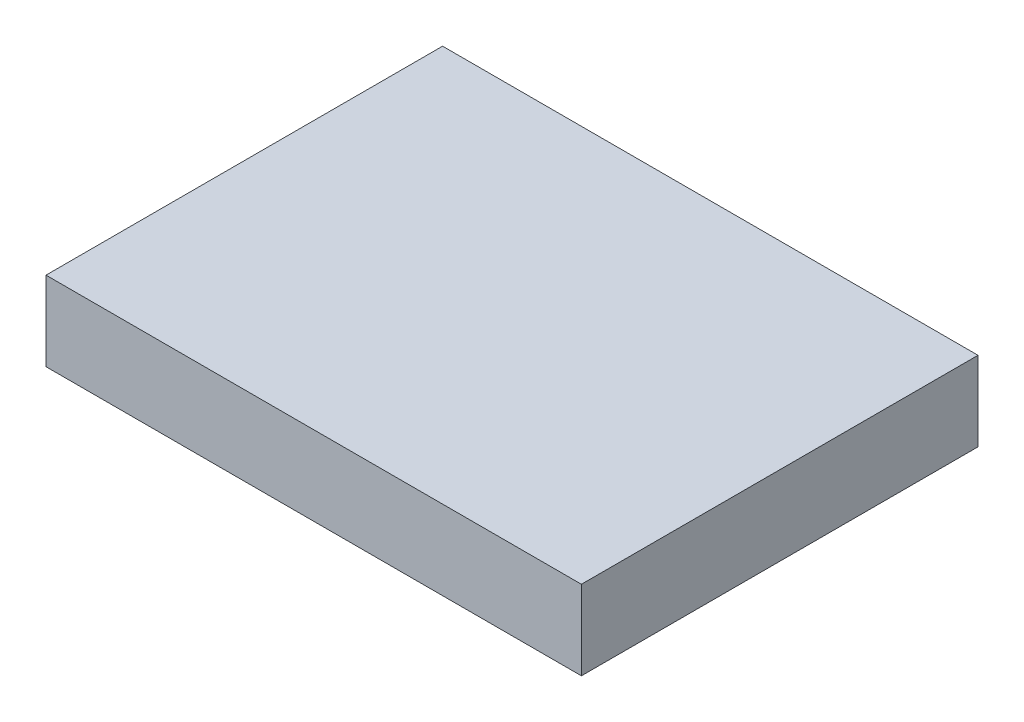
ISO-10303-21;
HEADER;
FILE_DESCRIPTION(('STEP AP214'),'2;1');
FILE_NAME('part.step','',(''),(''),'','','');
FILE_SCHEMA(('AUTOMOTIVE_DESIGN { 1 0 10303 214 1 1 1 1 }'));
ENDSEC;
DATA;
#1=APPLICATION_CONTEXT('core data for automotive mechanical design processes');
#2=APPLICATION_PROTOCOL_DEFINITION('international standard','automotive_design',2000,#1);
#3=PRODUCT_CONTEXT('',#1,'mechanical');
#4=PRODUCT('Part','Part','',(#3));
#5=PRODUCT_RELATED_PRODUCT_CATEGORY('part','',(#4));
#6=PRODUCT_DEFINITION_FORMATION('','',#4);
#7=PRODUCT_DEFINITION_CONTEXT('part definition',#1,'design');
#8=PRODUCT_DEFINITION('design','',#6,#7);
#9=PRODUCT_DEFINITION_SHAPE('','',#8);
#10=(LENGTH_UNIT() NAMED_UNIT(*) SI_UNIT(.MILLI.,.METRE.));
#11=(NAMED_UNIT(*) PLANE_ANGLE_UNIT() SI_UNIT($,.RADIAN.));
#12=(NAMED_UNIT(*) SI_UNIT($,.STERADIAN.) SOLID_ANGLE_UNIT());
#13=UNCERTAINTY_MEASURE_WITH_UNIT(LENGTH_MEASURE(1.E-05),#10,'distance_accuracy_value','');
#14=(GEOMETRIC_REPRESENTATION_CONTEXT(3) GLOBAL_UNCERTAINTY_ASSIGNED_CONTEXT((#13)) GLOBAL_UNIT_ASSIGNED_CONTEXT((#10,
#11,#12)) REPRESENTATION_CONTEXT('',''));
#15=CARTESIAN_POINT('',(0.,0.,0.));
#16=DIRECTION('',(0.,0.,1.));
#17=DIRECTION('',(1.,0.,0.));
#18=AXIS2_PLACEMENT_3D('',#15,#16,#17);
#19=CARTESIAN_POINT('',(0.,4.,0.));
#20=DIRECTION('',(-1.,0.,0.));
#21=DIRECTION('',(0.,0.,1.));
#22=AXIS2_PLACEMENT_3D('',#19,#20,#21);
#23=PLANE('',#22);
#24=DIRECTION('',(0.,0.,-1.));
#25=VECTOR('',#24,1.);
#26=CARTESIAN_POINT('',(0.,0.,0.));
#27=LINE('',#26,#25);
#28=CARTESIAN_POINT('',(0.,0.,0.));
#29=VERTEX_POINT('',#28);
#30=CARTESIAN_POINT('',(0.,0.,-20.));
#31=VERTEX_POINT('',#30);
#32=EDGE_CURVE('E99',#29,#31,#27,.T.);
#33=ORIENTED_EDGE('',*,*,#32,.F.);
#34=DIRECTION('',(0.,-1.,0.));
#35=VECTOR('',#34,1.);
#36=CARTESIAN_POINT('',(0.,4.,0.));
#37=LINE('',#36,#35);
#38=CARTESIAN_POINT('',(0.,4.,0.));
#39=VERTEX_POINT('',#38);
#40=EDGE_CURVE('E11',#39,#29,#37,.T.);
#41=ORIENTED_EDGE('',*,*,#40,.F.);
#42=DIRECTION('',(0.,0.,-1.));
#43=VECTOR('',#42,1.);
#44=CARTESIAN_POINT('',(0.,4.,0.));
#45=LINE('',#44,#43);
#46=CARTESIAN_POINT('',(0.,4.,-20.));
#47=VERTEX_POINT('',#46);
#48=EDGE_CURVE('E94',#39,#47,#45,.T.);
#49=ORIENTED_EDGE('',*,*,#48,.T.);
#50=DIRECTION('',(0.,-1.,0.));
#51=VECTOR('',#50,1.);
#52=CARTESIAN_POINT('',(0.,4.,-20.));
#53=LINE('',#52,#51);
#54=EDGE_CURVE('E37',#47,#31,#53,.T.);
#55=ORIENTED_EDGE('',*,*,#54,.T.);
#56=EDGE_LOOP('',(#33,#41,#49,#55));
#57=FACE_BOUND('',#56,.T.);
#58=ADVANCED_FACE('F34',(#57),#23,.T.);
#59=CARTESIAN_POINT('',(0.,4.,0.));
#60=DIRECTION('',(0.,0.,-1.));
#61=DIRECTION('',(-1.,0.,0.));
#62=AXIS2_PLACEMENT_3D('',#59,#60,#61);
#63=PLANE('',#62);
#64=DIRECTION('',(1.,0.,0.));
#65=VECTOR('',#64,1.);
#66=CARTESIAN_POINT('',(0.,0.,0.));
#67=LINE('',#66,#65);
#68=CARTESIAN_POINT('',(27.,0.,0.));
#69=VERTEX_POINT('',#68);
#70=EDGE_CURVE('E67',#29,#69,#67,.T.);
#71=ORIENTED_EDGE('',*,*,#70,.T.);
#72=DIRECTION('',(0.,-1.,0.));
#73=VECTOR('',#72,1.);
#74=CARTESIAN_POINT('',(27.,4.,0.));
#75=LINE('',#74,#73);
#76=CARTESIAN_POINT('',(27.,4.,0.));
#77=VERTEX_POINT('',#76);
#78=EDGE_CURVE('E43',#77,#69,#75,.T.);
#79=ORIENTED_EDGE('',*,*,#78,.F.);
#80=DIRECTION('',(1.,0.,0.));
#81=VECTOR('',#80,1.);
#82=CARTESIAN_POINT('',(0.,4.,0.));
#83=LINE('',#82,#81);
#84=EDGE_CURVE('E84',#39,#77,#83,.T.);
#85=ORIENTED_EDGE('',*,*,#84,.F.);
#86=ORIENTED_EDGE('',*,*,#40,.T.);
#87=EDGE_LOOP('',(#71,#79,#85,#86));
#88=FACE_BOUND('',#87,.T.);
#89=ADVANCED_FACE('F109',(#88),#63,.F.);
#90=CARTESIAN_POINT('',(27.,4.,0.));
#91=DIRECTION('',(-1.,0.,0.));
#92=DIRECTION('',(0.,0.,1.));
#93=AXIS2_PLACEMENT_3D('',#90,#91,#92);
#94=PLANE('',#93);
#95=DIRECTION('',(0.,0.,-1.));
#96=VECTOR('',#95,1.);
#97=CARTESIAN_POINT('',(27.,0.,0.));
#98=LINE('',#97,#96);
#99=CARTESIAN_POINT('',(27.,0.,-20.));
#100=VERTEX_POINT('',#99);
#101=EDGE_CURVE('E91',#69,#100,#98,.T.);
#102=ORIENTED_EDGE('',*,*,#101,.T.);
#103=DIRECTION('',(0.,-1.,0.));
#104=VECTOR('',#103,1.);
#105=CARTESIAN_POINT('',(27.,4.,-20.));
#106=LINE('',#105,#104);
#107=CARTESIAN_POINT('',(27.,4.,-20.));
#108=VERTEX_POINT('',#107);
#109=EDGE_CURVE('E88',#108,#100,#106,.T.);
#110=ORIENTED_EDGE('',*,*,#109,.F.);
#111=DIRECTION('',(0.,0.,-1.));
#112=VECTOR('',#111,1.);
#113=CARTESIAN_POINT('',(27.,4.,0.));
#114=LINE('',#113,#112);
#115=EDGE_CURVE('E79',#77,#108,#114,.T.);
#116=ORIENTED_EDGE('',*,*,#115,.F.);
#117=ORIENTED_EDGE('',*,*,#78,.T.);
#118=EDGE_LOOP('',(#102,#110,#116,#117));
#119=FACE_BOUND('',#118,.T.);
#120=ADVANCED_FACE('F89',(#119),#94,.F.);
#121=CARTESIAN_POINT('',(0.,4.,-20.));
#122=DIRECTION('',(0.,0.,-1.));
#123=DIRECTION('',(-1.,0.,0.));
#124=AXIS2_PLACEMENT_3D('',#121,#122,#123);
#125=PLANE('',#124);
#126=DIRECTION('',(1.,0.,0.));
#127=VECTOR('',#126,1.);
#128=CARTESIAN_POINT('',(0.,0.,-20.));
#129=LINE('',#128,#127);
#130=EDGE_CURVE('E102',#31,#100,#129,.T.);
#131=ORIENTED_EDGE('',*,*,#130,.F.);
#132=ORIENTED_EDGE('',*,*,#54,.F.);
#133=DIRECTION('',(1.,0.,0.));
#134=VECTOR('',#133,1.);
#135=CARTESIAN_POINT('',(0.,4.,-20.));
#136=LINE('',#135,#134);
#137=EDGE_CURVE('E83',#47,#108,#136,.T.);
#138=ORIENTED_EDGE('',*,*,#137,.T.);
#139=ORIENTED_EDGE('',*,*,#109,.T.);
#140=EDGE_LOOP('',(#131,#132,#138,#139));
#141=FACE_BOUND('',#140,.T.);
#142=ADVANCED_FACE('F93',(#141),#125,.T.);
#143=CARTESIAN_POINT('',(0.,4.,0.));
#144=DIRECTION('',(0.,-1.,0.));
#145=DIRECTION('',(0.,0.,-1.));
#146=AXIS2_PLACEMENT_3D('',#143,#144,#145);
#147=PLANE('',#146);
#148=ORIENTED_EDGE('',*,*,#48,.F.);
#149=ORIENTED_EDGE('',*,*,#84,.T.);
#150=ORIENTED_EDGE('',*,*,#115,.T.);
#151=ORIENTED_EDGE('',*,*,#137,.F.);
#152=EDGE_LOOP('',(#148,#149,#150,#151));
#153=FACE_BOUND('',#152,.T.);
#154=ADVANCED_FACE('F82',(#153),#147,.F.);
#155=CARTESIAN_POINT('',(0.,0.,0.));
#156=DIRECTION('',(0.,-1.,0.));
#157=DIRECTION('',(0.,0.,-1.));
#158=AXIS2_PLACEMENT_3D('',#155,#156,#157);
#159=PLANE('',#158);
#160=ORIENTED_EDGE('',*,*,#32,.T.);
#161=ORIENTED_EDGE('',*,*,#130,.T.);
#162=ORIENTED_EDGE('',*,*,#101,.F.);
#163=ORIENTED_EDGE('',*,*,#70,.F.);
#164=EDGE_LOOP('',(#160,#161,#162,#163));
#165=FACE_BOUND('',#164,.T.);
#166=ADVANCED_FACE('F107',(#165),#159,.T.);
#167=CLOSED_SHELL('',(#58,#89,#120,#142,#154,#166));
#168=MANIFOLD_SOLID_BREP('B2',#167);
#169=ADVANCED_BREP_SHAPE_REPRESENTATION('',(#18,#168),#14);
#170=SHAPE_DEFINITION_REPRESENTATION(#9,#169);
ENDSEC;
END-ISO-10303-21;
